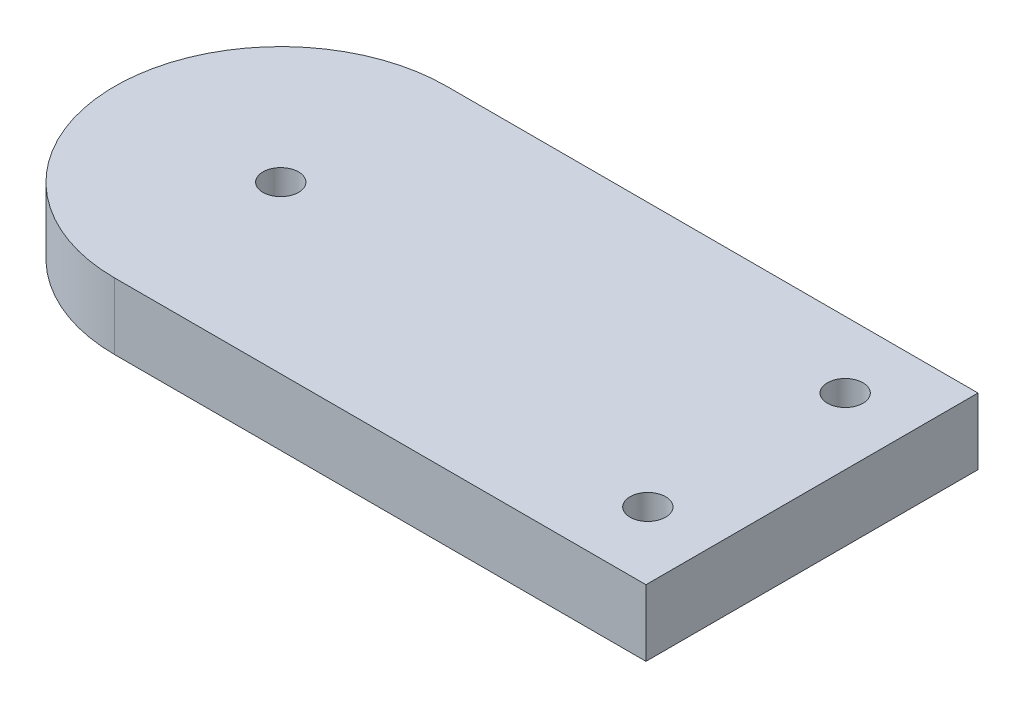
ISO-10303-21;
HEADER;
FILE_DESCRIPTION(('STEP AP214'),'2;1');
FILE_NAME('part.step','',(''),(''),'','','');
FILE_SCHEMA(('AUTOMOTIVE_DESIGN { 1 0 10303 214 1 1 1 1 }'));
ENDSEC;
DATA;
#1=APPLICATION_CONTEXT('core data for automotive mechanical design processes');
#2=APPLICATION_PROTOCOL_DEFINITION('international standard','automotive_design',2000,#1);
#3=PRODUCT_CONTEXT('',#1,'mechanical');
#4=PRODUCT('Part','Part','',(#3));
#5=PRODUCT_RELATED_PRODUCT_CATEGORY('part','',(#4));
#6=PRODUCT_DEFINITION_FORMATION('','',#4);
#7=PRODUCT_DEFINITION_CONTEXT('part definition',#1,'design');
#8=PRODUCT_DEFINITION('design','',#6,#7);
#9=PRODUCT_DEFINITION_SHAPE('','',#8);
#10=(LENGTH_UNIT() NAMED_UNIT(*) SI_UNIT(.MILLI.,.METRE.));
#11=(NAMED_UNIT(*) PLANE_ANGLE_UNIT() SI_UNIT($,.RADIAN.));
#12=(NAMED_UNIT(*) SI_UNIT($,.STERADIAN.) SOLID_ANGLE_UNIT());
#13=UNCERTAINTY_MEASURE_WITH_UNIT(LENGTH_MEASURE(1.E-05),#10,'distance_accuracy_value','');
#14=(GEOMETRIC_REPRESENTATION_CONTEXT(3) GLOBAL_UNCERTAINTY_ASSIGNED_CONTEXT((#13)) GLOBAL_UNIT_ASSIGNED_CONTEXT((#10,
#11,#12)) REPRESENTATION_CONTEXT('',''));
#15=CARTESIAN_POINT('',(0.,0.,0.));
#16=DIRECTION('',(0.,0.,1.));
#17=DIRECTION('',(1.,0.,0.));
#18=AXIS2_PLACEMENT_3D('',#15,#16,#17);
#19=CARTESIAN_POINT('',(-25.4,3.175,-7.93749999999761));
#20=DIRECTION('',(0.,-1.,0.));
#21=DIRECTION('',(0.,0.,-1.));
#22=AXIS2_PLACEMENT_3D('',#19,#20,#21);
#23=PLANE('',#22);
#24=DIRECTION('',(-1.,0.,0.));
#25=VECTOR('',#24,1.);
#26=CARTESIAN_POINT('',(-25.4,3.175,-15.8749999999952));
#27=LINE('',#26,#25);
#28=CARTESIAN_POINT('',(0.,3.175,-15.8749999999952));
#29=VERTEX_POINT('',#28);
#30=CARTESIAN_POINT('',(-25.4,3.175,-15.8749999999952));
#31=VERTEX_POINT('',#30);
#32=EDGE_CURVE('E98',#29,#31,#27,.T.);
#33=ORIENTED_EDGE('',*,*,#32,.T.);
#34=CARTESIAN_POINT('',(-25.4,3.175,-7.93749999999761));
#35=DIRECTION('',(0.,1.,0.));
#36=DIRECTION('',(0.,0.,-1.));
#37=AXIS2_PLACEMENT_3D('',#34,#35,#36);
#38=CIRCLE('',#37,7.93749999999761);
#39=CARTESIAN_POINT('',(-25.4,3.175,0.));
#40=VERTEX_POINT('',#39);
#41=EDGE_CURVE('E93',#31,#40,#38,.T.);
#42=ORIENTED_EDGE('',*,*,#41,.T.);
#43=DIRECTION('',(1.,0.,0.));
#44=VECTOR('',#43,1.);
#45=CARTESIAN_POINT('',(-25.4,3.175,0.));
#46=LINE('',#45,#44);
#47=CARTESIAN_POINT('',(0.,3.175,0.));
#48=VERTEX_POINT('',#47);
#49=EDGE_CURVE('E96',#40,#48,#46,.T.);
#50=ORIENTED_EDGE('',*,*,#49,.T.);
#51=DIRECTION('',(0.,0.,-1.));
#52=VECTOR('',#51,1.);
#53=CARTESIAN_POINT('',(0.,3.175,0.));
#54=LINE('',#53,#52);
#55=EDGE_CURVE('E63',#48,#29,#54,.T.);
#56=ORIENTED_EDGE('',*,*,#55,.T.);
#57=EDGE_LOOP('',(#33,#42,#50,#56));
#58=FACE_BOUND('',#57,.T.);
#59=CARTESIAN_POINT('',(-25.4,3.175,-7.93749999999761));
#60=DIRECTION('',(0.,1.,0.));
#61=DIRECTION('',(0.,0.,1.));
#62=AXIS2_PLACEMENT_3D('',#59,#60,#61);
#63=CIRCLE('',#62,0.850900000000002);
#64=CARTESIAN_POINT('',(-25.4,3.175,-7.0865999999976));
#65=VERTEX_POINT('',#64);
#66=EDGE_CURVE('E118',#65,#65,#63,.T.);
#67=ORIENTED_EDGE('',*,*,#66,.F.);
#68=EDGE_LOOP('',(#67));
#69=FACE_BOUND('',#68,.T.);
#70=CARTESIAN_POINT('',(-3.175,3.175,-12.6999999999952));
#71=DIRECTION('',(0.,1.,0.));
#72=DIRECTION('',(0.,0.,1.));
#73=AXIS2_PLACEMENT_3D('',#70,#71,#72);
#74=CIRCLE('',#73,0.8509);
#75=CARTESIAN_POINT('',(-3.175,3.175,-11.8490999999952));
#76=VERTEX_POINT('',#75);
#77=EDGE_CURVE('E140',#76,#76,#74,.T.);
#78=ORIENTED_EDGE('',*,*,#77,.F.);
#79=EDGE_LOOP('',(#78));
#80=FACE_BOUND('',#79,.T.);
#81=CARTESIAN_POINT('',(-3.175,3.175,-3.2639));
#82=DIRECTION('',(0.,1.,0.));
#83=DIRECTION('',(0.,0.,1.));
#84=AXIS2_PLACEMENT_3D('',#81,#82,#83);
#85=CIRCLE('',#84,0.8509);
#86=CARTESIAN_POINT('',(-3.175,3.175,-2.413));
#87=VERTEX_POINT('',#86);
#88=EDGE_CURVE('E148',#87,#87,#85,.T.);
#89=ORIENTED_EDGE('',*,*,#88,.F.);
#90=EDGE_LOOP('',(#89));
#91=FACE_BOUND('',#90,.T.);
#92=ADVANCED_FACE('F45',(#58,#69,#80,#91),#23,.F.);
#93=CARTESIAN_POINT('',(-25.4,0.,-7.93749999999761));
#94=DIRECTION('',(0.,-1.,0.));
#95=DIRECTION('',(0.,0.,-1.));
#96=AXIS2_PLACEMENT_3D('',#93,#94,#95);
#97=PLANE('',#96);
#98=CARTESIAN_POINT('',(-3.175,0.,-12.6999999999952));
#99=DIRECTION('',(0.,1.,0.));
#100=DIRECTION('',(0.,0.,1.));
#101=AXIS2_PLACEMENT_3D('',#98,#99,#100);
#102=CIRCLE('',#101,0.8509);
#103=CARTESIAN_POINT('',(-3.175,0.,-11.8490999999952));
#104=VERTEX_POINT('',#103);
#105=EDGE_CURVE('E144',#104,#104,#102,.T.);
#106=ORIENTED_EDGE('',*,*,#105,.T.);
#107=EDGE_LOOP('',(#106));
#108=FACE_BOUND('',#107,.T.);
#109=DIRECTION('',(-1.,0.,0.));
#110=VECTOR('',#109,1.);
#111=CARTESIAN_POINT('',(-25.4,0.,-15.8749999999952));
#112=LINE('',#111,#110);
#113=CARTESIAN_POINT('',(0.,0.,-15.8749999999952));
#114=VERTEX_POINT('',#113);
#115=CARTESIAN_POINT('',(-25.4,0.,-15.8749999999952));
#116=VERTEX_POINT('',#115);
#117=EDGE_CURVE('E114',#114,#116,#112,.T.);
#118=ORIENTED_EDGE('',*,*,#117,.F.);
#119=DIRECTION('',(0.,0.,-1.));
#120=VECTOR('',#119,1.);
#121=CARTESIAN_POINT('',(0.,0.,0.));
#122=LINE('',#121,#120);
#123=CARTESIAN_POINT('',(0.,0.,0.));
#124=VERTEX_POINT('',#123);
#125=EDGE_CURVE('E86',#124,#114,#122,.T.);
#126=ORIENTED_EDGE('',*,*,#125,.F.);
#127=DIRECTION('',(1.,0.,0.));
#128=VECTOR('',#127,1.);
#129=CARTESIAN_POINT('',(-25.4,0.,0.));
#130=LINE('',#129,#128);
#131=CARTESIAN_POINT('',(-25.4,0.,0.));
#132=VERTEX_POINT('',#131);
#133=EDGE_CURVE('E80',#132,#124,#130,.T.);
#134=ORIENTED_EDGE('',*,*,#133,.F.);
#135=CARTESIAN_POINT('',(-25.4,0.,-7.93749999999761));
#136=DIRECTION('',(0.,1.,0.));
#137=DIRECTION('',(0.,0.,-1.));
#138=AXIS2_PLACEMENT_3D('',#135,#136,#137);
#139=CIRCLE('',#138,7.93749999999761);
#140=EDGE_CURVE('E103',#116,#132,#139,.T.);
#141=ORIENTED_EDGE('',*,*,#140,.F.);
#142=EDGE_LOOP('',(#118,#126,#134,#141));
#143=FACE_BOUND('',#142,.T.);
#144=CARTESIAN_POINT('',(-25.4,0.,-7.93749999999761));
#145=DIRECTION('',(0.,1.,0.));
#146=DIRECTION('',(0.,0.,1.));
#147=AXIS2_PLACEMENT_3D('',#144,#145,#146);
#148=CIRCLE('',#147,0.850900000000002);
#149=CARTESIAN_POINT('',(-25.4,0.,-7.0865999999976));
#150=VERTEX_POINT('',#149);
#151=EDGE_CURVE('E136',#150,#150,#148,.T.);
#152=ORIENTED_EDGE('',*,*,#151,.T.);
#153=EDGE_LOOP('',(#152));
#154=FACE_BOUND('',#153,.T.);
#155=CARTESIAN_POINT('',(-3.175,0.,-3.2639));
#156=DIRECTION('',(0.,1.,0.));
#157=DIRECTION('',(0.,0.,1.));
#158=AXIS2_PLACEMENT_3D('',#155,#156,#157);
#159=CIRCLE('',#158,0.8509);
#160=CARTESIAN_POINT('',(-3.175,0.,-2.413));
#161=VERTEX_POINT('',#160);
#162=EDGE_CURVE('E152',#161,#161,#159,.T.);
#163=ORIENTED_EDGE('',*,*,#162,.T.);
#164=EDGE_LOOP('',(#163));
#165=FACE_BOUND('',#164,.T.);
#166=ADVANCED_FACE('F131',(#108,#143,#154,#165),#97,.T.);
#167=CARTESIAN_POINT('',(-25.4,3.175,-15.8749999999952));
#168=DIRECTION('',(0.,0.,1.));
#169=DIRECTION('',(1.,0.,0.));
#170=AXIS2_PLACEMENT_3D('',#167,#168,#169);
#171=PLANE('',#170);
#172=ORIENTED_EDGE('',*,*,#117,.T.);
#173=DIRECTION('',(0.,-1.,0.));
#174=VECTOR('',#173,1.);
#175=CARTESIAN_POINT('',(-25.4,3.175,-15.8749999999952));
#176=LINE('',#175,#174);
#177=EDGE_CURVE('E11',#31,#116,#176,.T.);
#178=ORIENTED_EDGE('',*,*,#177,.F.);
#179=ORIENTED_EDGE('',*,*,#32,.F.);
#180=DIRECTION('',(0.,-1.,0.));
#181=VECTOR('',#180,1.);
#182=CARTESIAN_POINT('',(0.,3.175,-15.8749999999952));
#183=LINE('',#182,#181);
#184=EDGE_CURVE('E110',#29,#114,#183,.T.);
#185=ORIENTED_EDGE('',*,*,#184,.T.);
#186=EDGE_LOOP('',(#172,#178,#179,#185));
#187=FACE_BOUND('',#186,.T.);
#188=ADVANCED_FACE('F47',(#187),#171,.F.);
#189=CARTESIAN_POINT('',(-25.4,3.175,-7.93749999999761));
#190=DIRECTION('',(0.,-1.,0.));
#191=DIRECTION('',(0.,0.,-1.));
#192=AXIS2_PLACEMENT_3D('',#189,#190,#191);
#193=CYLINDRICAL_SURFACE('',#192,7.93749999999761);
#194=ORIENTED_EDGE('',*,*,#140,.T.);
#195=DIRECTION('',(0.,-1.,0.));
#196=VECTOR('',#195,1.);
#197=CARTESIAN_POINT('',(-25.4,3.175,0.));
#198=LINE('',#197,#196);
#199=EDGE_CURVE('E55',#40,#132,#198,.T.);
#200=ORIENTED_EDGE('',*,*,#199,.F.);
#201=ORIENTED_EDGE('',*,*,#41,.F.);
#202=ORIENTED_EDGE('',*,*,#177,.T.);
#203=EDGE_LOOP('',(#194,#200,#201,#202));
#204=FACE_BOUND('',#203,.T.);
#205=ADVANCED_FACE('F102',(#204),#193,.T.);
#206=CARTESIAN_POINT('',(-25.4,3.175,0.));
#207=DIRECTION('',(0.,0.,-1.));
#208=DIRECTION('',(-1.,0.,0.));
#209=AXIS2_PLACEMENT_3D('',#206,#207,#208);
#210=PLANE('',#209);
#211=ORIENTED_EDGE('',*,*,#133,.T.);
#212=DIRECTION('',(0.,-1.,0.));
#213=VECTOR('',#212,1.);
#214=CARTESIAN_POINT('',(0.,3.175,0.));
#215=LINE('',#214,#213);
#216=EDGE_CURVE('E105',#48,#124,#215,.T.);
#217=ORIENTED_EDGE('',*,*,#216,.F.);
#218=ORIENTED_EDGE('',*,*,#49,.F.);
#219=ORIENTED_EDGE('',*,*,#199,.T.);
#220=EDGE_LOOP('',(#211,#217,#218,#219));
#221=FACE_BOUND('',#220,.T.);
#222=ADVANCED_FACE('F106',(#221),#210,.F.);
#223=CARTESIAN_POINT('',(0.,3.175,0.));
#224=DIRECTION('',(-1.,0.,0.));
#225=DIRECTION('',(0.,0.,1.));
#226=AXIS2_PLACEMENT_3D('',#223,#224,#225);
#227=PLANE('',#226);
#228=ORIENTED_EDGE('',*,*,#125,.T.);
#229=ORIENTED_EDGE('',*,*,#184,.F.);
#230=ORIENTED_EDGE('',*,*,#55,.F.);
#231=ORIENTED_EDGE('',*,*,#216,.T.);
#232=EDGE_LOOP('',(#228,#229,#230,#231));
#233=FACE_BOUND('',#232,.T.);
#234=ADVANCED_FACE('F128',(#233),#227,.F.);
#235=CARTESIAN_POINT('',(-25.4,3.175,-7.93749999999761));
#236=DIRECTION('',(0.,-1.,0.));
#237=DIRECTION('',(0.,0.,-1.));
#238=AXIS2_PLACEMENT_3D('',#235,#236,#237);
#239=CYLINDRICAL_SURFACE('',#238,0.850900000000002);
#240=ORIENTED_EDGE('',*,*,#66,.T.);
#241=EDGE_LOOP('',(#240));
#242=FACE_BOUND('',#241,.T.);
#243=ORIENTED_EDGE('',*,*,#151,.F.);
#244=EDGE_LOOP('',(#243));
#245=FACE_BOUND('',#244,.T.);
#246=ADVANCED_FACE('F171',(#242,#245),#239,.F.);
#247=CARTESIAN_POINT('',(-3.175,3.175,-12.6999999999952));
#248=DIRECTION('',(0.,-1.,0.));
#249=DIRECTION('',(0.,0.,-1.));
#250=AXIS2_PLACEMENT_3D('',#247,#248,#249);
#251=CYLINDRICAL_SURFACE('',#250,0.8509);
#252=ORIENTED_EDGE('',*,*,#77,.T.);
#253=EDGE_LOOP('',(#252));
#254=FACE_BOUND('',#253,.T.);
#255=ORIENTED_EDGE('',*,*,#105,.F.);
#256=EDGE_LOOP('',(#255));
#257=FACE_BOUND('',#256,.T.);
#258=ADVANCED_FACE('F216',(#254,#257),#251,.F.);
#259=CARTESIAN_POINT('',(-3.175,3.175,-3.2639));
#260=DIRECTION('',(0.,-1.,0.));
#261=DIRECTION('',(0.,0.,-1.));
#262=AXIS2_PLACEMENT_3D('',#259,#260,#261);
#263=CYLINDRICAL_SURFACE('',#262,0.8509);
#264=ORIENTED_EDGE('',*,*,#88,.T.);
#265=EDGE_LOOP('',(#264));
#266=FACE_BOUND('',#265,.T.);
#267=ORIENTED_EDGE('',*,*,#162,.F.);
#268=EDGE_LOOP('',(#267));
#269=FACE_BOUND('',#268,.T.);
#270=ADVANCED_FACE('F160',(#266,#269),#263,.F.);
#271=CLOSED_SHELL('',(#92,#166,#188,#205,#222,#234,#246,#258,#270));
#272=MANIFOLD_SOLID_BREP('B2',#271);
#273=ADVANCED_BREP_SHAPE_REPRESENTATION('',(#18,#272),#14);
#274=SHAPE_DEFINITION_REPRESENTATION(#9,#273);
ENDSEC;
END-ISO-10303-21;
